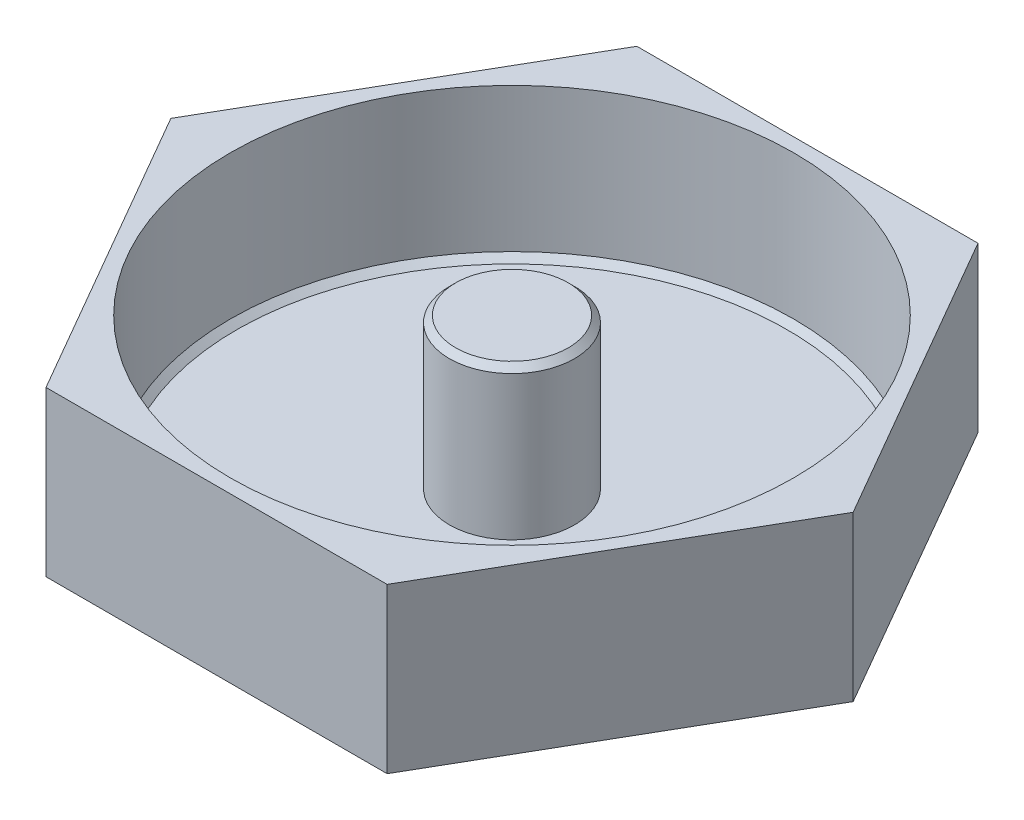
ISO-10303-21;
HEADER;
FILE_DESCRIPTION(('STEP AP214'),'2;1');
FILE_NAME('part.step','',(''),(''),'','','');
FILE_SCHEMA(('AUTOMOTIVE_DESIGN { 1 0 10303 214 1 1 1 1 }'));
ENDSEC;
DATA;
#1=APPLICATION_CONTEXT('core data for automotive mechanical design processes');
#2=APPLICATION_PROTOCOL_DEFINITION('international standard','automotive_design',2000,#1);
#3=PRODUCT_CONTEXT('',#1,'mechanical');
#4=PRODUCT('Part','Part','',(#3));
#5=PRODUCT_RELATED_PRODUCT_CATEGORY('part','',(#4));
#6=PRODUCT_DEFINITION_FORMATION('','',#4);
#7=PRODUCT_DEFINITION_CONTEXT('part definition',#1,'design');
#8=PRODUCT_DEFINITION('design','',#6,#7);
#9=PRODUCT_DEFINITION_SHAPE('','',#8);
#10=(LENGTH_UNIT() NAMED_UNIT(*) SI_UNIT(.MILLI.,.METRE.));
#11=(NAMED_UNIT(*) PLANE_ANGLE_UNIT() SI_UNIT($,.RADIAN.));
#12=(NAMED_UNIT(*) SI_UNIT($,.STERADIAN.) SOLID_ANGLE_UNIT());
#13=UNCERTAINTY_MEASURE_WITH_UNIT(LENGTH_MEASURE(1.E-05),#10,'distance_accuracy_value','');
#14=(GEOMETRIC_REPRESENTATION_CONTEXT(3) GLOBAL_UNCERTAINTY_ASSIGNED_CONTEXT((#13)) GLOBAL_UNIT_ASSIGNED_CONTEXT((#10,
#11,#12)) REPRESENTATION_CONTEXT('',''));
#15=CARTESIAN_POINT('',(0.,0.,0.));
#16=DIRECTION('',(0.,0.,1.));
#17=DIRECTION('',(1.,0.,0.));
#18=AXIS2_PLACEMENT_3D('',#15,#16,#17);
#19=CARTESIAN_POINT('',(20.4381995293128,12.,11.8));
#20=DIRECTION('',(-0.866025403784439,0.,-0.5));
#21=DIRECTION('',(-0.5,0.,0.866025403784439));
#22=AXIS2_PLACEMENT_3D('',#19,#20,#21);
#23=PLANE('',#22);
#24=DIRECTION('',(0.,-1.,0.));
#25=VECTOR('',#24,1.);
#26=CARTESIAN_POINT('',(13.6254663528752,12.,23.6));
#27=LINE('',#26,#25);
#28=CARTESIAN_POINT('',(13.6254663528752,12.,23.6));
#29=VERTEX_POINT('',#28);
#30=CARTESIAN_POINT('',(13.6254663528752,-1.1,23.6));
#31=VERTEX_POINT('',#30);
#32=EDGE_CURVE('E168',#29,#31,#27,.T.);
#33=ORIENTED_EDGE('',*,*,#32,.T.);
#34=DIRECTION('',(-0.5,0.,0.866025403784439));
#35=VECTOR('',#34,1.);
#36=CARTESIAN_POINT('',(13.6254663528752,-1.1,23.6));
#37=LINE('',#36,#35);
#38=CARTESIAN_POINT('',(27.2509327057503,-1.1,0.));
#39=VERTEX_POINT('',#38);
#40=EDGE_CURVE('E137',#39,#31,#37,.T.);
#41=ORIENTED_EDGE('',*,*,#40,.F.);
#42=DIRECTION('',(0.,-1.,0.));
#43=VECTOR('',#42,1.);
#44=CARTESIAN_POINT('',(27.2509327057503,12.,0.));
#45=LINE('',#44,#43);
#46=CARTESIAN_POINT('',(27.2509327057503,12.,0.));
#47=VERTEX_POINT('',#46);
#48=EDGE_CURVE('E127',#47,#39,#45,.T.);
#49=ORIENTED_EDGE('',*,*,#48,.F.);
#50=DIRECTION('',(0.5,0.,-0.866025403784439));
#51=VECTOR('',#50,1.);
#52=CARTESIAN_POINT('',(20.4381995293128,12.,11.8));
#53=LINE('',#52,#51);
#54=EDGE_CURVE('E159',#29,#47,#53,.T.);
#55=ORIENTED_EDGE('',*,*,#54,.F.);
#56=EDGE_LOOP('',(#33,#41,#49,#55));
#57=FACE_BOUND('',#56,.T.);
#58=ADVANCED_FACE('F64',(#57),#23,.F.);
#59=CARTESIAN_POINT('',(20.4381995293128,12.,-11.8));
#60=DIRECTION('',(-0.866025403784439,0.,0.5));
#61=DIRECTION('',(0.5,0.,0.866025403784439));
#62=AXIS2_PLACEMENT_3D('',#59,#60,#61);
#63=PLANE('',#62);
#64=ORIENTED_EDGE('',*,*,#48,.T.);
#65=DIRECTION('',(0.5,0.,0.866025403784438));
#66=VECTOR('',#65,1.);
#67=CARTESIAN_POINT('',(27.2509327057503,-1.1,0.));
#68=LINE('',#67,#66);
#69=CARTESIAN_POINT('',(13.6254663528752,-1.1,-23.6));
#70=VERTEX_POINT('',#69);
#71=EDGE_CURVE('E131',#70,#39,#68,.T.);
#72=ORIENTED_EDGE('',*,*,#71,.F.);
#73=DIRECTION('',(0.,-1.,0.));
#74=VECTOR('',#73,1.);
#75=CARTESIAN_POINT('',(13.6254663528752,12.,-23.6));
#76=LINE('',#75,#74);
#77=CARTESIAN_POINT('',(13.6254663528752,12.,-23.6));
#78=VERTEX_POINT('',#77);
#79=EDGE_CURVE('E119',#78,#70,#76,.T.);
#80=ORIENTED_EDGE('',*,*,#79,.F.);
#81=DIRECTION('',(-0.5,0.,-0.866025403784439));
#82=VECTOR('',#81,1.);
#83=CARTESIAN_POINT('',(20.4381995293128,12.,-11.8));
#84=LINE('',#83,#82);
#85=EDGE_CURVE('E161',#47,#78,#84,.T.);
#86=ORIENTED_EDGE('',*,*,#85,.F.);
#87=EDGE_LOOP('',(#64,#72,#80,#86));
#88=FACE_BOUND('',#87,.T.);
#89=ADVANCED_FACE('F132',(#88),#63,.F.);
#90=CARTESIAN_POINT('',(0.,12.,-23.6));
#91=DIRECTION('',(0.,0.,1.));
#92=DIRECTION('',(1.,0.,0.));
#93=AXIS2_PLACEMENT_3D('',#90,#91,#92);
#94=PLANE('',#93);
#95=ORIENTED_EDGE('',*,*,#79,.T.);
#96=DIRECTION('',(1.,0.,0.));
#97=VECTOR('',#96,1.);
#98=CARTESIAN_POINT('',(13.6254663528752,-1.1,-23.6));
#99=LINE('',#98,#97);
#100=CARTESIAN_POINT('',(-13.6254663528752,-1.1,-23.6));
#101=VERTEX_POINT('',#100);
#102=EDGE_CURVE('E124',#101,#70,#99,.T.);
#103=ORIENTED_EDGE('',*,*,#102,.F.);
#104=DIRECTION('',(0.,-1.,0.));
#105=VECTOR('',#104,1.);
#106=CARTESIAN_POINT('',(-13.6254663528752,12.,-23.6));
#107=LINE('',#106,#105);
#108=CARTESIAN_POINT('',(-13.6254663528752,12.,-23.6));
#109=VERTEX_POINT('',#108);
#110=EDGE_CURVE('E128',#109,#101,#107,.T.);
#111=ORIENTED_EDGE('',*,*,#110,.F.);
#112=DIRECTION('',(-1.,0.,0.));
#113=VECTOR('',#112,1.);
#114=CARTESIAN_POINT('',(0.,12.,-23.6));
#115=LINE('',#114,#113);
#116=EDGE_CURVE('E125',#78,#109,#115,.T.);
#117=ORIENTED_EDGE('',*,*,#116,.F.);
#118=EDGE_LOOP('',(#95,#103,#111,#117));
#119=FACE_BOUND('',#118,.T.);
#120=ADVANCED_FACE('F121',(#119),#94,.F.);
#121=CARTESIAN_POINT('',(-20.4381995293128,12.,-11.8));
#122=DIRECTION('',(0.866025403784439,0.,0.5));
#123=DIRECTION('',(0.5,0.,-0.866025403784439));
#124=AXIS2_PLACEMENT_3D('',#121,#122,#123);
#125=PLANE('',#124);
#126=ORIENTED_EDGE('',*,*,#110,.T.);
#127=DIRECTION('',(0.5,0.,-0.866025403784439));
#128=VECTOR('',#127,1.);
#129=CARTESIAN_POINT('',(-13.6254663528752,-1.1,-23.6));
#130=LINE('',#129,#128);
#131=CARTESIAN_POINT('',(-27.2509327057503,-1.1,0.));
#132=VERTEX_POINT('',#131);
#133=EDGE_CURVE('E143',#132,#101,#130,.T.);
#134=ORIENTED_EDGE('',*,*,#133,.F.);
#135=DIRECTION('',(0.,-1.,0.));
#136=VECTOR('',#135,1.);
#137=CARTESIAN_POINT('',(-27.2509327057503,12.,0.));
#138=LINE('',#137,#136);
#139=CARTESIAN_POINT('',(-27.2509327057503,12.,0.));
#140=VERTEX_POINT('',#139);
#141=EDGE_CURVE('E172',#140,#132,#138,.T.);
#142=ORIENTED_EDGE('',*,*,#141,.F.);
#143=DIRECTION('',(-0.5,0.,0.866025403784439));
#144=VECTOR('',#143,1.);
#145=CARTESIAN_POINT('',(-20.4381995293128,12.,-11.8));
#146=LINE('',#145,#144);
#147=EDGE_CURVE('E164',#109,#140,#146,.T.);
#148=ORIENTED_EDGE('',*,*,#147,.F.);
#149=EDGE_LOOP('',(#126,#134,#142,#148));
#150=FACE_BOUND('',#149,.T.);
#151=ADVANCED_FACE('F222',(#150),#125,.F.);
#152=CARTESIAN_POINT('',(-20.4381995293128,12.,11.8));
#153=DIRECTION('',(0.866025403784438,0.,-0.5));
#154=DIRECTION('',(-0.5,0.,-0.866025403784439));
#155=AXIS2_PLACEMENT_3D('',#152,#153,#154);
#156=PLANE('',#155);
#157=ORIENTED_EDGE('',*,*,#141,.T.);
#158=DIRECTION('',(-0.5,0.,-0.866025403784438));
#159=VECTOR('',#158,1.);
#160=CARTESIAN_POINT('',(-27.2509327057503,-1.1,0.));
#161=LINE('',#160,#159);
#162=CARTESIAN_POINT('',(-13.6254663528752,-1.1,23.6));
#163=VERTEX_POINT('',#162);
#164=EDGE_CURVE('E153',#163,#132,#161,.T.);
#165=ORIENTED_EDGE('',*,*,#164,.F.);
#166=DIRECTION('',(0.,-1.,0.));
#167=VECTOR('',#166,1.);
#168=CARTESIAN_POINT('',(-13.6254663528752,12.,23.6));
#169=LINE('',#168,#167);
#170=CARTESIAN_POINT('',(-13.6254663528752,12.,23.6));
#171=VERTEX_POINT('',#170);
#172=EDGE_CURVE('E170',#171,#163,#169,.T.);
#173=ORIENTED_EDGE('',*,*,#172,.F.);
#174=DIRECTION('',(0.5,0.,0.866025403784438));
#175=VECTOR('',#174,1.);
#176=CARTESIAN_POINT('',(-20.4381995293128,12.,11.8));
#177=LINE('',#176,#175);
#178=EDGE_CURVE('E85',#140,#171,#177,.T.);
#179=ORIENTED_EDGE('',*,*,#178,.F.);
#180=EDGE_LOOP('',(#157,#165,#173,#179));
#181=FACE_BOUND('',#180,.T.);
#182=ADVANCED_FACE('F208',(#181),#156,.F.);
#183=CARTESIAN_POINT('',(0.,12.,0.));
#184=DIRECTION('',(0.,-1.,0.));
#185=DIRECTION('',(0.,0.,-1.));
#186=AXIS2_PLACEMENT_3D('',#183,#184,#185);
#187=CYLINDRICAL_SURFACE('',#186,22.5);
#188=CARTESIAN_POINT('',(0.,0.499999999999997,0.));
#189=DIRECTION('',(0.,1.,0.));
#190=DIRECTION('',(0.,0.,1.));
#191=AXIS2_PLACEMENT_3D('',#188,#189,#190);
#192=CIRCLE('',#191,22.5);
#193=CARTESIAN_POINT('',(0.,0.499999999999997,22.5));
#194=VERTEX_POINT('',#193);
#195=EDGE_CURVE('E12',#194,#194,#192,.F.);
#196=ORIENTED_EDGE('',*,*,#195,.T.);
#197=EDGE_LOOP('',(#196));
#198=FACE_BOUND('',#197,.T.);
#199=CARTESIAN_POINT('',(0.,12.,0.));
#200=DIRECTION('',(0.,1.,0.));
#201=DIRECTION('',(0.,0.,1.));
#202=AXIS2_PLACEMENT_3D('',#199,#200,#201);
#203=CIRCLE('',#202,22.5);
#204=CARTESIAN_POINT('',(0.,12.,22.5));
#205=VERTEX_POINT('',#204);
#206=EDGE_CURVE('E156',#205,#205,#203,.T.);
#207=ORIENTED_EDGE('',*,*,#206,.T.);
#208=EDGE_LOOP('',(#207));
#209=FACE_BOUND('',#208,.T.);
#210=ADVANCED_FACE('F205',(#198,#209),#187,.F.);
#211=CARTESIAN_POINT('',(0.,12.,23.6));
#212=DIRECTION('',(0.,0.,-1.));
#213=DIRECTION('',(-1.,0.,0.));
#214=AXIS2_PLACEMENT_3D('',#211,#212,#213);
#215=PLANE('',#214);
#216=ORIENTED_EDGE('',*,*,#172,.T.);
#217=DIRECTION('',(-1.,0.,0.));
#218=VECTOR('',#217,1.);
#219=CARTESIAN_POINT('',(-13.6254663528752,-1.1,23.6));
#220=LINE('',#219,#218);
#221=EDGE_CURVE('E150',#31,#163,#220,.T.);
#222=ORIENTED_EDGE('',*,*,#221,.F.);
#223=ORIENTED_EDGE('',*,*,#32,.F.);
#224=DIRECTION('',(1.,0.,0.));
#225=VECTOR('',#224,1.);
#226=CARTESIAN_POINT('',(0.,12.,23.6));
#227=LINE('',#226,#225);
#228=EDGE_CURVE('E80',#171,#29,#227,.T.);
#229=ORIENTED_EDGE('',*,*,#228,.F.);
#230=EDGE_LOOP('',(#216,#222,#223,#229));
#231=FACE_BOUND('',#230,.T.);
#232=ADVANCED_FACE('F207',(#231),#215,.F.);
#233=CARTESIAN_POINT('',(0.,12.,0.));
#234=DIRECTION('',(0.,1.,0.));
#235=DIRECTION('',(0.,0.,1.));
#236=AXIS2_PLACEMENT_3D('',#233,#234,#235);
#237=PLANE('',#236);
#238=ORIENTED_EDGE('',*,*,#206,.F.);
#239=EDGE_LOOP('',(#238));
#240=FACE_BOUND('',#239,.T.);
#241=ORIENTED_EDGE('',*,*,#54,.T.);
#242=ORIENTED_EDGE('',*,*,#85,.T.);
#243=ORIENTED_EDGE('',*,*,#116,.T.);
#244=ORIENTED_EDGE('',*,*,#147,.T.);
#245=ORIENTED_EDGE('',*,*,#178,.T.);
#246=ORIENTED_EDGE('',*,*,#228,.T.);
#247=EDGE_LOOP('',(#241,#242,#243,#244,#245,#246));
#248=FACE_BOUND('',#247,.T.);
#249=ADVANCED_FACE('F219',(#240,#248),#237,.T.);
#250=CARTESIAN_POINT('',(0.,0.,0.));
#251=DIRECTION('',(0.,1.,0.));
#252=DIRECTION('',(0.,0.,1.));
#253=AXIS2_PLACEMENT_3D('',#250,#251,#252);
#254=PLANE('',#253);
#255=CARTESIAN_POINT('',(0.,0.,0.));
#256=DIRECTION('',(0.,1.,0.));
#257=DIRECTION('',(0.,0.,1.));
#258=AXIS2_PLACEMENT_3D('',#255,#256,#257);
#259=CIRCLE('',#258,22.);
#260=CARTESIAN_POINT('',(0.,0.,22.));
#261=VERTEX_POINT('',#260);
#262=EDGE_CURVE('E73',#261,#261,#259,.T.);
#263=ORIENTED_EDGE('',*,*,#262,.T.);
#264=EDGE_LOOP('',(#263));
#265=FACE_BOUND('',#264,.T.);
#266=CARTESIAN_POINT('',(0.,0.,0.));
#267=DIRECTION('',(0.,1.,0.));
#268=DIRECTION('',(0.,0.,1.));
#269=AXIS2_PLACEMENT_3D('',#266,#267,#268);
#270=CIRCLE('',#269,5.);
#271=CARTESIAN_POINT('',(0.,0.,5.));
#272=VERTEX_POINT('',#271);
#273=EDGE_CURVE('E144',#272,#272,#270,.T.);
#274=ORIENTED_EDGE('',*,*,#273,.F.);
#275=EDGE_LOOP('',(#274));
#276=FACE_BOUND('',#275,.T.);
#277=ADVANCED_FACE('F184',(#265,#276),#254,.T.);
#278=CARTESIAN_POINT('',(0.,-1.1,0.));
#279=DIRECTION('',(0.,1.,0.));
#280=DIRECTION('',(0.,0.,1.));
#281=AXIS2_PLACEMENT_3D('',#278,#279,#280);
#282=PLANE('',#281);
#283=ORIENTED_EDGE('',*,*,#102,.T.);
#284=ORIENTED_EDGE('',*,*,#71,.T.);
#285=ORIENTED_EDGE('',*,*,#40,.T.);
#286=ORIENTED_EDGE('',*,*,#221,.T.);
#287=ORIENTED_EDGE('',*,*,#164,.T.);
#288=ORIENTED_EDGE('',*,*,#133,.T.);
#289=EDGE_LOOP('',(#283,#284,#285,#286,#287,#288));
#290=FACE_BOUND('',#289,.T.);
#291=ADVANCED_FACE('F140',(#290),#282,.F.);
#292=CARTESIAN_POINT('',(0.,12.,0.));
#293=DIRECTION('',(0.,-1.,0.));
#294=DIRECTION('',(0.,0.,-1.));
#295=AXIS2_PLACEMENT_3D('',#292,#293,#294);
#296=CYLINDRICAL_SURFACE('',#295,5.);
#297=CARTESIAN_POINT('',(0.,11.5,0.));
#298=DIRECTION('',(0.,1.,0.));
#299=DIRECTION('',(0.,0.,1.));
#300=AXIS2_PLACEMENT_3D('',#297,#298,#299);
#301=CIRCLE('',#300,5.);
#302=CARTESIAN_POINT('',(0.,11.5,5.));
#303=VERTEX_POINT('',#302);
#304=EDGE_CURVE('E179',#303,#303,#301,.F.);
#305=ORIENTED_EDGE('',*,*,#304,.T.);
#306=EDGE_LOOP('',(#305));
#307=FACE_BOUND('',#306,.T.);
#308=ORIENTED_EDGE('',*,*,#273,.T.);
#309=EDGE_LOOP('',(#308));
#310=FACE_BOUND('',#309,.T.);
#311=ADVANCED_FACE('F246',(#307,#310),#296,.T.);
#312=CARTESIAN_POINT('',(0.,12.,0.));
#313=DIRECTION('',(0.,1.,0.));
#314=DIRECTION('',(0.,0.,1.));
#315=AXIS2_PLACEMENT_3D('',#312,#313,#314);
#316=PLANE('',#315);
#317=CARTESIAN_POINT('',(0.,12.,0.));
#318=DIRECTION('',(0.,1.,0.));
#319=DIRECTION('',(0.,0.,1.));
#320=AXIS2_PLACEMENT_3D('',#317,#318,#319);
#321=CIRCLE('',#320,4.50000000000001);
#322=CARTESIAN_POINT('',(0.,12.,4.50000000000001));
#323=VERTEX_POINT('',#322);
#324=EDGE_CURVE('E176',#323,#323,#321,.T.);
#325=ORIENTED_EDGE('',*,*,#324,.T.);
#326=EDGE_LOOP('',(#325));
#327=FACE_BOUND('',#326,.T.);
#328=ADVANCED_FACE('F193',(#327),#316,.T.);
#329=CARTESIAN_POINT('',(0.,12.,0.));
#330=DIRECTION('',(0.,-1.,0.));
#331=DIRECTION('',(0.,0.,-1.));
#332=AXIS2_PLACEMENT_3D('',#329,#330,#331);
#333=CONICAL_SURFACE('',#332,4.50000000000001,0.785398163397444);
#334=ORIENTED_EDGE('',*,*,#304,.F.);
#335=EDGE_LOOP('',(#334));
#336=FACE_BOUND('',#335,.T.);
#337=ORIENTED_EDGE('',*,*,#324,.F.);
#338=EDGE_LOOP('',(#337));
#339=FACE_BOUND('',#338,.T.);
#340=ADVANCED_FACE('F188',(#336,#339),#333,.T.);
#341=CARTESIAN_POINT('',(0.,0.,0.));
#342=DIRECTION('',(0.,1.,0.));
#343=DIRECTION('',(0.,0.,1.));
#344=AXIS2_PLACEMENT_3D('',#341,#342,#343);
#345=CONICAL_SURFACE('',#344,22.,0.785398163397452);
#346=ORIENTED_EDGE('',*,*,#195,.F.);
#347=EDGE_LOOP('',(#346));
#348=FACE_BOUND('',#347,.T.);
#349=ORIENTED_EDGE('',*,*,#262,.F.);
#350=EDGE_LOOP('',(#349));
#351=FACE_BOUND('',#350,.T.);
#352=ADVANCED_FACE('F67',(#348,#351),#345,.F.);
#353=CLOSED_SHELL('',(#58,#89,#120,#151,#182,#210,#232,#249,#277,#291,#311,#328,#340,#352));
#354=MANIFOLD_SOLID_BREP('B2',#353);
#355=ADVANCED_BREP_SHAPE_REPRESENTATION('',(#18,#354),#14);
#356=SHAPE_DEFINITION_REPRESENTATION(#9,#355);
ENDSEC;
END-ISO-10303-21;
